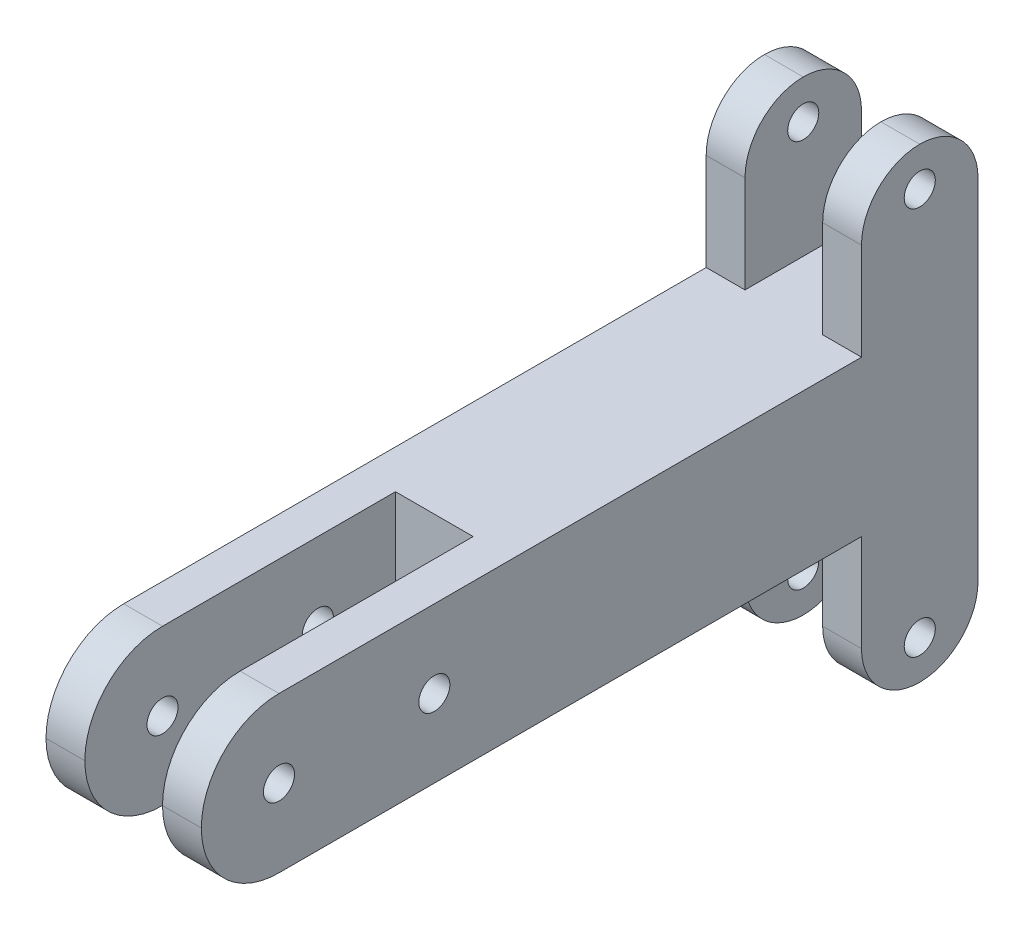
ISO-10303-21;
HEADER;
FILE_DESCRIPTION(('STEP AP214'),'2;1');
FILE_NAME('part.step','',(''),(''),'','','');
FILE_SCHEMA(('AUTOMOTIVE_DESIGN { 1 0 10303 214 1 1 1 1 }'));
ENDSEC;
DATA;
#1=APPLICATION_CONTEXT('core data for automotive mechanical design processes');
#2=APPLICATION_PROTOCOL_DEFINITION('international standard','automotive_design',2000,#1);
#3=PRODUCT_CONTEXT('',#1,'mechanical');
#4=PRODUCT('Part','Part','',(#3));
#5=PRODUCT_RELATED_PRODUCT_CATEGORY('part','',(#4));
#6=PRODUCT_DEFINITION_FORMATION('','',#4);
#7=PRODUCT_DEFINITION_CONTEXT('part definition',#1,'design');
#8=PRODUCT_DEFINITION('design','',#6,#7);
#9=PRODUCT_DEFINITION_SHAPE('','',#8);
#10=(LENGTH_UNIT() NAMED_UNIT(*) SI_UNIT(.MILLI.,.METRE.));
#11=(NAMED_UNIT(*) PLANE_ANGLE_UNIT() SI_UNIT($,.RADIAN.));
#12=(NAMED_UNIT(*) SI_UNIT($,.STERADIAN.) SOLID_ANGLE_UNIT());
#13=UNCERTAINTY_MEASURE_WITH_UNIT(LENGTH_MEASURE(1.E-05),#10,'distance_accuracy_value','');
#14=(GEOMETRIC_REPRESENTATION_CONTEXT(3) GLOBAL_UNCERTAINTY_ASSIGNED_CONTEXT((#13)) GLOBAL_UNIT_ASSIGNED_CONTEXT((#10,
#11,#12)) REPRESENTATION_CONTEXT('',''));
#15=CARTESIAN_POINT('',(0.,0.,0.));
#16=DIRECTION('',(0.,0.,1.));
#17=DIRECTION('',(1.,0.,0.));
#18=AXIS2_PLACEMENT_3D('',#15,#16,#17);
#19=CARTESIAN_POINT('',(-9.99999999999999,40.,-35.));
#20=DIRECTION('',(0.,0.,-1.));
#21=DIRECTION('',(-1.,0.,0.));
#22=AXIS2_PLACEMENT_3D('',#19,#20,#21);
#23=PLANE('',#22);
#24=DIRECTION('',(0.,-1.,0.));
#25=VECTOR('',#24,1.);
#26=CARTESIAN_POINT('',(10.,40.,-35.));
#27=LINE('',#26,#25);
#28=CARTESIAN_POINT('',(10.,32.5,-35.));
#29=VERTEX_POINT('',#28);
#30=CARTESIAN_POINT('',(10.,20.,-35.));
#31=VERTEX_POINT('',#30);
#32=EDGE_CURVE('E238',#29,#31,#27,.T.);
#33=ORIENTED_EDGE('',*,*,#32,.F.);
#34=DIRECTION('',(1.,0.,0.));
#35=VECTOR('',#34,1.);
#36=CARTESIAN_POINT('',(5.,32.5,-35.));
#37=LINE('',#36,#35);
#38=CARTESIAN_POINT('',(5.,32.5,-35.));
#39=VERTEX_POINT('',#38);
#40=EDGE_CURVE('E227',#29,#39,#37,.F.);
#41=ORIENTED_EDGE('',*,*,#40,.T.);
#42=DIRECTION('',(0.,1.,0.));
#43=VECTOR('',#42,1.);
#44=CARTESIAN_POINT('',(5.,40.,-35.));
#45=LINE('',#44,#43);
#46=CARTESIAN_POINT('',(5.,20.,-35.));
#47=VERTEX_POINT('',#46);
#48=EDGE_CURVE('E210',#47,#39,#45,.T.);
#49=ORIENTED_EDGE('',*,*,#48,.F.);
#50=DIRECTION('',(1.,0.,0.));
#51=VECTOR('',#50,1.);
#52=CARTESIAN_POINT('',(-9.99999999999999,20.,-35.));
#53=LINE('',#52,#51);
#54=EDGE_CURVE('E224',#47,#31,#53,.T.);
#55=ORIENTED_EDGE('',*,*,#54,.T.);
#56=EDGE_LOOP('',(#33,#41,#49,#55));
#57=FACE_BOUND('',#56,.T.);
#58=ADVANCED_FACE('F33',(#57),#23,.F.);
#59=CARTESIAN_POINT('',(-9.99999999999999,-20.,-35.));
#60=DIRECTION('',(0.,0.,1.));
#61=DIRECTION('',(1.,0.,0.));
#62=AXIS2_PLACEMENT_3D('',#59,#60,#61);
#63=PLANE('',#62);
#64=DIRECTION('',(0.,-1.,0.));
#65=VECTOR('',#64,1.);
#66=CARTESIAN_POINT('',(4.99999999999999,-20.,-35.));
#67=LINE('',#66,#65);
#68=CARTESIAN_POINT('',(4.99999999999999,0.,-35.));
#69=VERTEX_POINT('',#68);
#70=CARTESIAN_POINT('',(4.99999999999999,-12.5,-35.));
#71=VERTEX_POINT('',#70);
#72=EDGE_CURVE('E418',#69,#71,#67,.T.);
#73=ORIENTED_EDGE('',*,*,#72,.T.);
#74=DIRECTION('',(1.,0.,0.));
#75=VECTOR('',#74,1.);
#76=CARTESIAN_POINT('',(-9.99999999999999,-12.5,-35.));
#77=LINE('',#76,#75);
#78=CARTESIAN_POINT('',(10.,-12.5,-35.));
#79=VERTEX_POINT('',#78);
#80=EDGE_CURVE('E374',#71,#79,#77,.T.);
#81=ORIENTED_EDGE('',*,*,#80,.T.);
#82=DIRECTION('',(0.,1.,0.));
#83=VECTOR('',#82,1.);
#84=CARTESIAN_POINT('',(10.,-20.,-35.));
#85=LINE('',#84,#83);
#86=CARTESIAN_POINT('',(10.,0.,-35.));
#87=VERTEX_POINT('',#86);
#88=EDGE_CURVE('E235',#79,#87,#85,.T.);
#89=ORIENTED_EDGE('',*,*,#88,.T.);
#90=DIRECTION('',(1.,0.,0.));
#91=VECTOR('',#90,1.);
#92=CARTESIAN_POINT('',(-9.99999999999999,0.,-35.));
#93=LINE('',#92,#91);
#94=EDGE_CURVE('E432',#69,#87,#93,.T.);
#95=ORIENTED_EDGE('',*,*,#94,.F.);
#96=EDGE_LOOP('',(#73,#81,#89,#95));
#97=FACE_BOUND('',#96,.T.);
#98=ADVANCED_FACE('F472',(#97),#63,.T.);
#99=CARTESIAN_POINT('',(10.,-15.,-42.5));
#100=DIRECTION('',(-1.,0.,0.));
#101=DIRECTION('',(0.,0.,1.));
#102=AXIS2_PLACEMENT_3D('',#99,#100,#101);
#103=CYLINDRICAL_SURFACE('',#102,2.);
#104=CARTESIAN_POINT('',(4.99999999999999,-15.,-42.5));
#105=DIRECTION('',(1.,0.,0.));
#106=DIRECTION('',(0.,0.,-1.));
#107=AXIS2_PLACEMENT_3D('',#104,#105,#106);
#108=CIRCLE('',#107,2.);
#109=CARTESIAN_POINT('',(4.99999999999999,-15.,-44.5));
#110=VERTEX_POINT('',#109);
#111=EDGE_CURVE('E428',#110,#110,#108,.T.);
#112=ORIENTED_EDGE('',*,*,#111,.F.);
#113=EDGE_LOOP('',(#112));
#114=FACE_BOUND('',#113,.T.);
#115=CARTESIAN_POINT('',(10.,-15.,-42.5));
#116=DIRECTION('',(-1.,0.,0.));
#117=DIRECTION('',(0.,0.,1.));
#118=AXIS2_PLACEMENT_3D('',#115,#116,#117);
#119=CIRCLE('',#118,2.);
#120=CARTESIAN_POINT('',(10.,-15.,-40.5));
#121=VERTEX_POINT('',#120);
#122=EDGE_CURVE('E436',#121,#121,#119,.T.);
#123=ORIENTED_EDGE('',*,*,#122,.F.);
#124=EDGE_LOOP('',(#123));
#125=FACE_BOUND('',#124,.T.);
#126=ADVANCED_FACE('F597',(#114,#125),#103,.F.);
#127=CARTESIAN_POINT('',(10.,35.,-42.5));
#128=DIRECTION('',(-1.,0.,0.));
#129=DIRECTION('',(0.,0.,1.));
#130=AXIS2_PLACEMENT_3D('',#127,#128,#129);
#131=CYLINDRICAL_SURFACE('',#130,2.);
#132=CARTESIAN_POINT('',(5.,35.,-42.5));
#133=DIRECTION('',(1.,0.,0.));
#134=DIRECTION('',(0.,1.,0.));
#135=AXIS2_PLACEMENT_3D('',#132,#133,#134);
#136=CIRCLE('',#135,2.);
#137=CARTESIAN_POINT('',(5.,37.,-42.5));
#138=VERTEX_POINT('',#137);
#139=EDGE_CURVE('E442',#138,#138,#136,.T.);
#140=ORIENTED_EDGE('',*,*,#139,.F.);
#141=EDGE_LOOP('',(#140));
#142=FACE_BOUND('',#141,.T.);
#143=CARTESIAN_POINT('',(10.,35.,-42.5));
#144=DIRECTION('',(-1.,0.,0.));
#145=DIRECTION('',(0.,0.,1.));
#146=AXIS2_PLACEMENT_3D('',#143,#144,#145);
#147=CIRCLE('',#146,2.);
#148=CARTESIAN_POINT('',(10.,35.,-40.5));
#149=VERTEX_POINT('',#148);
#150=EDGE_CURVE('E429',#149,#149,#147,.T.);
#151=ORIENTED_EDGE('',*,*,#150,.F.);
#152=EDGE_LOOP('',(#151));
#153=FACE_BOUND('',#152,.T.);
#154=ADVANCED_FACE('F502',(#142,#153),#131,.F.);
#155=CARTESIAN_POINT('',(0.,20.,0.));
#156=DIRECTION('',(0.,-1.,0.));
#157=DIRECTION('',(0.,0.,-1.));
#158=AXIS2_PLACEMENT_3D('',#155,#156,#157);
#159=PLANE('',#158);
#160=CARTESIAN_POINT('',(-10.,20.,-35.));
#161=VERTEX_POINT('',#160);
#162=CARTESIAN_POINT('',(-5.00000000000001,20.,-35.));
#163=VERTEX_POINT('',#162);
#164=EDGE_CURVE('E234',#161,#163,#53,.T.);
#165=ORIENTED_EDGE('',*,*,#164,.F.);
#166=DIRECTION('',(0.,0.,1.));
#167=VECTOR('',#166,1.);
#168=CARTESIAN_POINT('',(-10.,20.,50.));
#169=LINE('',#168,#167);
#170=CARTESIAN_POINT('',(-10.,20.,40.));
#171=VERTEX_POINT('',#170);
#172=EDGE_CURVE('E291',#161,#171,#169,.T.);
#173=ORIENTED_EDGE('',*,*,#172,.T.);
#174=DIRECTION('',(1.,0.,0.));
#175=VECTOR('',#174,1.);
#176=CARTESIAN_POINT('',(0.,20.,40.));
#177=LINE('',#176,#175);
#178=CARTESIAN_POINT('',(-5.,20.,40.));
#179=VERTEX_POINT('',#178);
#180=EDGE_CURVE('E332',#171,#179,#177,.T.);
#181=ORIENTED_EDGE('',*,*,#180,.T.);
#182=DIRECTION('',(0.,0.,1.));
#183=VECTOR('',#182,1.);
#184=CARTESIAN_POINT('',(-5.,20.,50.));
#185=LINE('',#184,#183);
#186=CARTESIAN_POINT('',(-5.,20.,10.));
#187=VERTEX_POINT('',#186);
#188=EDGE_CURVE('E268',#187,#179,#185,.T.);
#189=ORIENTED_EDGE('',*,*,#188,.F.);
#190=DIRECTION('',(-1.,0.,0.));
#191=VECTOR('',#190,1.);
#192=CARTESIAN_POINT('',(-5.,20.,10.));
#193=LINE('',#192,#191);
#194=CARTESIAN_POINT('',(5.,20.,10.));
#195=VERTEX_POINT('',#194);
#196=EDGE_CURVE('E273',#195,#187,#193,.T.);
#197=ORIENTED_EDGE('',*,*,#196,.F.);
#198=DIRECTION('',(0.,0.,-1.));
#199=VECTOR('',#198,1.);
#200=CARTESIAN_POINT('',(5.,20.,50.));
#201=LINE('',#200,#199);
#202=CARTESIAN_POINT('',(5.,20.,40.));
#203=VERTEX_POINT('',#202);
#204=EDGE_CURVE('E281',#203,#195,#201,.T.);
#205=ORIENTED_EDGE('',*,*,#204,.F.);
#206=DIRECTION('',(1.,0.,0.));
#207=VECTOR('',#206,1.);
#208=CARTESIAN_POINT('',(0.,20.,40.));
#209=LINE('',#208,#207);
#210=CARTESIAN_POINT('',(10.,20.,40.));
#211=VERTEX_POINT('',#210);
#212=EDGE_CURVE('E330',#203,#211,#209,.T.);
#213=ORIENTED_EDGE('',*,*,#212,.T.);
#214=DIRECTION('',(0.,0.,-1.));
#215=VECTOR('',#214,1.);
#216=CARTESIAN_POINT('',(10.,20.,50.));
#217=LINE('',#216,#215);
#218=EDGE_CURVE('E233',#211,#31,#217,.T.);
#219=ORIENTED_EDGE('',*,*,#218,.T.);
#220=ORIENTED_EDGE('',*,*,#54,.F.);
#221=DIRECTION('',(0.,0.,-1.));
#222=VECTOR('',#221,1.);
#223=CARTESIAN_POINT('',(5.,20.,50.001));
#224=LINE('',#223,#222);
#225=CARTESIAN_POINT('',(5.,20.,-50.));
#226=VERTEX_POINT('',#225);
#227=EDGE_CURVE('E206',#47,#226,#224,.T.);
#228=ORIENTED_EDGE('',*,*,#227,.T.);
#229=DIRECTION('',(-1.,0.,0.));
#230=VECTOR('',#229,1.);
#231=CARTESIAN_POINT('',(5.,20.,-50.));
#232=LINE('',#231,#230);
#233=CARTESIAN_POINT('',(-5.00000000000001,20.,-50.));
#234=VERTEX_POINT('',#233);
#235=EDGE_CURVE('E488',#226,#234,#232,.T.);
#236=ORIENTED_EDGE('',*,*,#235,.T.);
#237=DIRECTION('',(0.,0.,-1.));
#238=VECTOR('',#237,1.);
#239=CARTESIAN_POINT('',(-5.00000000000001,20.,50.001));
#240=LINE('',#239,#238);
#241=EDGE_CURVE('E217',#163,#234,#240,.T.);
#242=ORIENTED_EDGE('',*,*,#241,.F.);
#243=EDGE_LOOP('',(#165,#173,#181,#189,#197,#205,#213,#219,#220,#228,#236,#242));
#244=FACE_BOUND('',#243,.T.);
#245=ADVANCED_FACE('F231',(#244),#159,.F.);
#246=CARTESIAN_POINT('',(10.,20.,50.));
#247=DIRECTION('',(-1.,0.,0.));
#248=DIRECTION('',(0.,0.,1.));
#249=AXIS2_PLACEMENT_3D('',#246,#247,#248);
#250=PLANE('',#249);
#251=ORIENTED_EDGE('',*,*,#150,.T.);
#252=EDGE_LOOP('',(#251));
#253=FACE_BOUND('',#252,.T.);
#254=ORIENTED_EDGE('',*,*,#122,.T.);
#255=EDGE_LOOP('',(#254));
#256=FACE_BOUND('',#255,.T.);
#257=CARTESIAN_POINT('',(10.,10.,40.));
#258=DIRECTION('',(1.,0.,0.));
#259=DIRECTION('',(0.,0.,-1.));
#260=AXIS2_PLACEMENT_3D('',#257,#258,#259);
#261=CIRCLE('',#260,2.);
#262=CARTESIAN_POINT('',(10.,10.,38.));
#263=VERTEX_POINT('',#262);
#264=EDGE_CURVE('E251',#263,#263,#261,.T.);
#265=ORIENTED_EDGE('',*,*,#264,.F.);
#266=EDGE_LOOP('',(#265));
#267=FACE_BOUND('',#266,.T.);
#268=CARTESIAN_POINT('',(10.,10.,20.));
#269=DIRECTION('',(1.,0.,0.));
#270=DIRECTION('',(0.,0.,-1.));
#271=AXIS2_PLACEMENT_3D('',#268,#269,#270);
#272=CIRCLE('',#271,2.);
#273=CARTESIAN_POINT('',(10.,10.,18.));
#274=VERTEX_POINT('',#273);
#275=EDGE_CURVE('E257',#274,#274,#272,.T.);
#276=ORIENTED_EDGE('',*,*,#275,.F.);
#277=EDGE_LOOP('',(#276));
#278=FACE_BOUND('',#277,.T.);
#279=CARTESIAN_POINT('',(10.,32.5,-42.5));
#280=DIRECTION('',(-1.,0.,0.));
#281=DIRECTION('',(0.,0.,1.));
#282=AXIS2_PLACEMENT_3D('',#279,#280,#281);
#283=CIRCLE('',#282,7.5);
#284=CARTESIAN_POINT('',(10.,32.5,-50.));
#285=VERTEX_POINT('',#284);
#286=CARTESIAN_POINT('',(10.,40.,-42.5));
#287=VERTEX_POINT('',#286);
#288=EDGE_CURVE('E365',#285,#287,#283,.F.);
#289=ORIENTED_EDGE('',*,*,#288,.T.);
#290=CARTESIAN_POINT('',(10.,32.5,-42.5));
#291=DIRECTION('',(-1.,0.,0.));
#292=DIRECTION('',(0.,0.,1.));
#293=AXIS2_PLACEMENT_3D('',#290,#291,#292);
#294=CIRCLE('',#293,7.5);
#295=EDGE_CURVE('E367',#287,#29,#294,.F.);
#296=ORIENTED_EDGE('',*,*,#295,.T.);
#297=ORIENTED_EDGE('',*,*,#32,.T.);
#298=ORIENTED_EDGE('',*,*,#218,.F.);
#299=CARTESIAN_POINT('',(10.,10.,40.));
#300=DIRECTION('',(-1.,0.,0.));
#301=DIRECTION('',(0.,0.,1.));
#302=AXIS2_PLACEMENT_3D('',#299,#300,#301);
#303=CIRCLE('',#302,10.);
#304=CARTESIAN_POINT('',(10.,10.,50.));
#305=VERTEX_POINT('',#304);
#306=EDGE_CURVE('E303',#211,#305,#303,.F.);
#307=ORIENTED_EDGE('',*,*,#306,.T.);
#308=CARTESIAN_POINT('',(10.,10.,40.));
#309=DIRECTION('',(-1.,0.,0.));
#310=DIRECTION('',(0.,0.,1.));
#311=AXIS2_PLACEMENT_3D('',#308,#309,#310);
#312=CIRCLE('',#311,10.);
#313=CARTESIAN_POINT('',(10.,0.,40.));
#314=VERTEX_POINT('',#313);
#315=EDGE_CURVE('E309',#305,#314,#312,.F.);
#316=ORIENTED_EDGE('',*,*,#315,.T.);
#317=DIRECTION('',(0.,0.,-1.));
#318=VECTOR('',#317,1.);
#319=CARTESIAN_POINT('',(10.,0.,50.));
#320=LINE('',#319,#318);
#321=EDGE_CURVE('E287',#314,#87,#320,.T.);
#322=ORIENTED_EDGE('',*,*,#321,.T.);
#323=ORIENTED_EDGE('',*,*,#88,.F.);
#324=CARTESIAN_POINT('',(10.,-12.5,-42.5));
#325=DIRECTION('',(-1.,0.,0.));
#326=DIRECTION('',(0.,0.,1.));
#327=AXIS2_PLACEMENT_3D('',#324,#325,#326);
#328=CIRCLE('',#327,7.5);
#329=CARTESIAN_POINT('',(10.,-20.,-42.5));
#330=VERTEX_POINT('',#329);
#331=EDGE_CURVE('E363',#79,#330,#328,.F.);
#332=ORIENTED_EDGE('',*,*,#331,.T.);
#333=CARTESIAN_POINT('',(10.,-12.5,-42.5));
#334=DIRECTION('',(-1.,0.,0.));
#335=DIRECTION('',(0.,0.,1.));
#336=AXIS2_PLACEMENT_3D('',#333,#334,#335);
#337=CIRCLE('',#336,7.5);
#338=CARTESIAN_POINT('',(10.,-12.5,-50.));
#339=VERTEX_POINT('',#338);
#340=EDGE_CURVE('E361',#330,#339,#337,.F.);
#341=ORIENTED_EDGE('',*,*,#340,.T.);
#342=DIRECTION('',(0.,-1.,0.));
#343=VECTOR('',#342,1.);
#344=CARTESIAN_POINT('',(10.,20.,-50.));
#345=LINE('',#344,#343);
#346=EDGE_CURVE('E300',#285,#339,#345,.T.);
#347=ORIENTED_EDGE('',*,*,#346,.F.);
#348=EDGE_LOOP('',(#289,#296,#297,#298,#307,#316,#322,#323,#332,#341,#347));
#349=FACE_BOUND('',#348,.T.);
#350=ADVANCED_FACE('F564',(#253,#256,#267,#278,#349),#250,.F.);
#351=CARTESIAN_POINT('',(-10.,20.,-50.));
#352=DIRECTION('',(0.,0.,1.));
#353=DIRECTION('',(1.,0.,0.));
#354=AXIS2_PLACEMENT_3D('',#351,#352,#353);
#355=PLANE('',#354);
#356=DIRECTION('',(0.,-1.,0.));
#357=VECTOR('',#356,1.);
#358=CARTESIAN_POINT('',(-10.,20.,-50.));
#359=LINE('',#358,#357);
#360=CARTESIAN_POINT('',(-10.,32.5,-50.));
#361=VERTEX_POINT('',#360);
#362=CARTESIAN_POINT('',(-10.,-12.5,-50.));
#363=VERTEX_POINT('',#362);
#364=EDGE_CURVE('E294',#361,#363,#359,.T.);
#365=ORIENTED_EDGE('',*,*,#364,.F.);
#366=DIRECTION('',(-1.,0.,0.));
#367=VECTOR('',#366,1.);
#368=CARTESIAN_POINT('',(-5.00000000000001,32.5,-50.));
#369=LINE('',#368,#367);
#370=CARTESIAN_POINT('',(-5.00000000000001,32.5,-50.));
#371=VERTEX_POINT('',#370);
#372=EDGE_CURVE('E359',#361,#371,#369,.F.);
#373=ORIENTED_EDGE('',*,*,#372,.T.);
#374=DIRECTION('',(0.,1.,0.));
#375=VECTOR('',#374,1.);
#376=CARTESIAN_POINT('',(-5.00000000000001,40.,-50.));
#377=LINE('',#376,#375);
#378=EDGE_CURVE('E218',#234,#371,#377,.T.);
#379=ORIENTED_EDGE('',*,*,#378,.F.);
#380=ORIENTED_EDGE('',*,*,#235,.F.);
#381=DIRECTION('',(0.,-1.,0.));
#382=VECTOR('',#381,1.);
#383=CARTESIAN_POINT('',(5.,40.,-50.));
#384=LINE('',#383,#382);
#385=CARTESIAN_POINT('',(5.,32.5,-50.));
#386=VERTEX_POINT('',#385);
#387=EDGE_CURVE('E212',#386,#226,#384,.T.);
#388=ORIENTED_EDGE('',*,*,#387,.F.);
#389=DIRECTION('',(-1.,0.,0.));
#390=VECTOR('',#389,1.);
#391=CARTESIAN_POINT('',(10.,32.5,-50.));
#392=LINE('',#391,#390);
#393=EDGE_CURVE('E357',#386,#285,#392,.F.);
#394=ORIENTED_EDGE('',*,*,#393,.T.);
#395=ORIENTED_EDGE('',*,*,#346,.T.);
#396=DIRECTION('',(-1.,0.,0.));
#397=VECTOR('',#396,1.);
#398=CARTESIAN_POINT('',(4.99999999999999,-12.5,-50.));
#399=LINE('',#398,#397);
#400=CARTESIAN_POINT('',(4.99999999999999,-12.5,-50.));
#401=VERTEX_POINT('',#400);
#402=EDGE_CURVE('E355',#339,#401,#399,.T.);
#403=ORIENTED_EDGE('',*,*,#402,.T.);
#404=DIRECTION('',(0.,-1.,0.));
#405=VECTOR('',#404,1.);
#406=CARTESIAN_POINT('',(4.99999999999999,-20.,-50.));
#407=LINE('',#406,#405);
#408=CARTESIAN_POINT('',(4.99999999999999,0.,-50.));
#409=VERTEX_POINT('',#408);
#410=EDGE_CURVE('E413',#409,#401,#407,.T.);
#411=ORIENTED_EDGE('',*,*,#410,.F.);
#412=DIRECTION('',(1.,0.,0.));
#413=VECTOR('',#412,1.);
#414=CARTESIAN_POINT('',(4.99999999999999,0.,-50.));
#415=LINE('',#414,#413);
#416=CARTESIAN_POINT('',(-5.00000000000001,0.,-50.));
#417=VERTEX_POINT('',#416);
#418=EDGE_CURVE('E412',#417,#409,#415,.T.);
#419=ORIENTED_EDGE('',*,*,#418,.F.);
#420=DIRECTION('',(0.,1.,0.));
#421=VECTOR('',#420,1.);
#422=CARTESIAN_POINT('',(-5.00000000000001,-20.,-50.));
#423=LINE('',#422,#421);
#424=CARTESIAN_POINT('',(-5.00000000000001,-12.5,-50.));
#425=VERTEX_POINT('',#424);
#426=EDGE_CURVE('E404',#425,#417,#423,.T.);
#427=ORIENTED_EDGE('',*,*,#426,.F.);
#428=DIRECTION('',(-1.,0.,0.));
#429=VECTOR('',#428,1.);
#430=CARTESIAN_POINT('',(-10.,-12.5,-50.));
#431=LINE('',#430,#429);
#432=EDGE_CURVE('E353',#425,#363,#431,.T.);
#433=ORIENTED_EDGE('',*,*,#432,.T.);
#434=EDGE_LOOP('',(#365,#373,#379,#380,#388,#394,#395,#403,#411,#419,#427,#433));
#435=FACE_BOUND('',#434,.T.);
#436=ADVANCED_FACE('F409',(#435),#355,.F.);
#437=CARTESIAN_POINT('',(-10.,20.,50.));
#438=DIRECTION('',(1.,0.,0.));
#439=DIRECTION('',(0.,0.,-1.));
#440=AXIS2_PLACEMENT_3D('',#437,#438,#439);
#441=PLANE('',#440);
#442=CARTESIAN_POINT('',(-10.,35.,-42.5));
#443=DIRECTION('',(-1.,0.,0.));
#444=DIRECTION('',(0.,0.,1.));
#445=AXIS2_PLACEMENT_3D('',#442,#443,#444);
#446=CIRCLE('',#445,2.);
#447=CARTESIAN_POINT('',(-10.,35.,-40.5));
#448=VERTEX_POINT('',#447);
#449=EDGE_CURVE('E433',#448,#448,#446,.T.);
#450=ORIENTED_EDGE('',*,*,#449,.F.);
#451=EDGE_LOOP('',(#450));
#452=FACE_BOUND('',#451,.T.);
#453=CARTESIAN_POINT('',(-10.,-15.,-42.5));
#454=DIRECTION('',(-1.,0.,0.));
#455=DIRECTION('',(0.,0.,1.));
#456=AXIS2_PLACEMENT_3D('',#453,#454,#455);
#457=CIRCLE('',#456,2.);
#458=CARTESIAN_POINT('',(-10.,-15.,-40.5));
#459=VERTEX_POINT('',#458);
#460=EDGE_CURVE('E439',#459,#459,#457,.T.);
#461=ORIENTED_EDGE('',*,*,#460,.F.);
#462=EDGE_LOOP('',(#461));
#463=FACE_BOUND('',#462,.T.);
#464=CARTESIAN_POINT('',(-10.,10.,40.));
#465=DIRECTION('',(1.,0.,0.));
#466=DIRECTION('',(0.,0.,-1.));
#467=AXIS2_PLACEMENT_3D('',#464,#465,#466);
#468=CIRCLE('',#467,2.);
#469=CARTESIAN_POINT('',(-10.,10.,38.));
#470=VERTEX_POINT('',#469);
#471=EDGE_CURVE('E247',#470,#470,#468,.T.);
#472=ORIENTED_EDGE('',*,*,#471,.T.);
#473=EDGE_LOOP('',(#472));
#474=FACE_BOUND('',#473,.T.);
#475=CARTESIAN_POINT('',(-10.,10.,20.));
#476=DIRECTION('',(1.,0.,0.));
#477=DIRECTION('',(0.,0.,-1.));
#478=AXIS2_PLACEMENT_3D('',#475,#476,#477);
#479=CIRCLE('',#478,2.);
#480=CARTESIAN_POINT('',(-10.,10.,18.));
#481=VERTEX_POINT('',#480);
#482=EDGE_CURVE('E254',#481,#481,#479,.T.);
#483=ORIENTED_EDGE('',*,*,#482,.T.);
#484=EDGE_LOOP('',(#483));
#485=FACE_BOUND('',#484,.T.);
#486=DIRECTION('',(0.,-1.,0.));
#487=VECTOR('',#486,1.);
#488=CARTESIAN_POINT('',(-9.99999999999999,40.,-35.));
#489=LINE('',#488,#487);
#490=CARTESIAN_POINT('',(-9.99999999999999,32.5,-35.));
#491=VERTEX_POINT('',#490);
#492=EDGE_CURVE('E244',#491,#161,#489,.T.);
#493=ORIENTED_EDGE('',*,*,#492,.F.);
#494=CARTESIAN_POINT('',(-10.,32.5,-42.5));
#495=DIRECTION('',(1.,0.,0.));
#496=DIRECTION('',(0.,0.,-1.));
#497=AXIS2_PLACEMENT_3D('',#494,#495,#496);
#498=CIRCLE('',#497,7.5);
#499=CARTESIAN_POINT('',(-10.,40.,-42.5));
#500=VERTEX_POINT('',#499);
#501=EDGE_CURVE('E351',#491,#500,#498,.F.);
#502=ORIENTED_EDGE('',*,*,#501,.T.);
#503=CARTESIAN_POINT('',(-10.,32.5,-42.5));
#504=DIRECTION('',(1.,0.,0.));
#505=DIRECTION('',(0.,0.,-1.));
#506=AXIS2_PLACEMENT_3D('',#503,#504,#505);
#507=CIRCLE('',#506,7.5);
#508=EDGE_CURVE('E349',#500,#361,#507,.F.);
#509=ORIENTED_EDGE('',*,*,#508,.T.);
#510=ORIENTED_EDGE('',*,*,#364,.T.);
#511=CARTESIAN_POINT('',(-10.,-12.5,-42.5));
#512=DIRECTION('',(1.,0.,0.));
#513=DIRECTION('',(0.,0.,-1.));
#514=AXIS2_PLACEMENT_3D('',#511,#512,#513);
#515=CIRCLE('',#514,7.5);
#516=CARTESIAN_POINT('',(-10.,-20.,-42.5));
#517=VERTEX_POINT('',#516);
#518=EDGE_CURVE('E345',#363,#517,#515,.F.);
#519=ORIENTED_EDGE('',*,*,#518,.T.);
#520=CARTESIAN_POINT('',(-10.,-12.5,-42.5));
#521=DIRECTION('',(1.,0.,0.));
#522=DIRECTION('',(0.,0.,-1.));
#523=AXIS2_PLACEMENT_3D('',#520,#521,#522);
#524=CIRCLE('',#523,7.5);
#525=CARTESIAN_POINT('',(-9.99999999999999,-12.5,-35.));
#526=VERTEX_POINT('',#525);
#527=EDGE_CURVE('E347',#517,#526,#524,.F.);
#528=ORIENTED_EDGE('',*,*,#527,.T.);
#529=DIRECTION('',(0.,1.,0.));
#530=VECTOR('',#529,1.);
#531=CARTESIAN_POINT('',(-9.99999999999999,-20.,-35.));
#532=LINE('',#531,#530);
#533=CARTESIAN_POINT('',(-9.99999999999999,0.,-35.));
#534=VERTEX_POINT('',#533);
#535=EDGE_CURVE('E239',#526,#534,#532,.T.);
#536=ORIENTED_EDGE('',*,*,#535,.T.);
#537=DIRECTION('',(0.,0.,1.));
#538=VECTOR('',#537,1.);
#539=CARTESIAN_POINT('',(-10.,0.,50.));
#540=LINE('',#539,#538);
#541=CARTESIAN_POINT('',(-10.,0.,40.));
#542=VERTEX_POINT('',#541);
#543=EDGE_CURVE('E292',#534,#542,#540,.T.);
#544=ORIENTED_EDGE('',*,*,#543,.T.);
#545=CARTESIAN_POINT('',(-10.,10.,40.));
#546=DIRECTION('',(1.,0.,0.));
#547=DIRECTION('',(0.,0.,-1.));
#548=AXIS2_PLACEMENT_3D('',#545,#546,#547);
#549=CIRCLE('',#548,10.);
#550=CARTESIAN_POINT('',(-10.,10.,50.));
#551=VERTEX_POINT('',#550);
#552=EDGE_CURVE('E328',#542,#551,#549,.F.);
#553=ORIENTED_EDGE('',*,*,#552,.T.);
#554=CARTESIAN_POINT('',(-10.,10.,40.));
#555=DIRECTION('',(1.,0.,0.));
#556=DIRECTION('',(0.,0.,-1.));
#557=AXIS2_PLACEMENT_3D('',#554,#555,#556);
#558=CIRCLE('',#557,10.);
#559=EDGE_CURVE('E325',#551,#171,#558,.F.);
#560=ORIENTED_EDGE('',*,*,#559,.T.);
#561=ORIENTED_EDGE('',*,*,#172,.F.);
#562=EDGE_LOOP('',(#493,#502,#509,#510,#519,#528,#536,#544,#553,#560,#561));
#563=FACE_BOUND('',#562,.T.);
#564=ADVANCED_FACE('F449',(#452,#463,#474,#485,#563),#441,.F.);
#565=CARTESIAN_POINT('',(0.,0.,0.));
#566=DIRECTION('',(0.,-1.,0.));
#567=DIRECTION('',(0.,0.,-1.));
#568=AXIS2_PLACEMENT_3D('',#565,#566,#567);
#569=PLANE('',#568);
#570=CARTESIAN_POINT('',(-5.00000000000001,0.,-35.));
#571=VERTEX_POINT('',#570);
#572=EDGE_CURVE('E443',#534,#571,#93,.T.);
#573=ORIENTED_EDGE('',*,*,#572,.T.);
#574=DIRECTION('',(0.,0.,-1.));
#575=VECTOR('',#574,1.);
#576=CARTESIAN_POINT('',(-5.00000000000001,0.,50.001));
#577=LINE('',#576,#575);
#578=EDGE_CURVE('E415',#571,#417,#577,.T.);
#579=ORIENTED_EDGE('',*,*,#578,.T.);
#580=ORIENTED_EDGE('',*,*,#418,.T.);
#581=DIRECTION('',(0.,0.,-1.));
#582=VECTOR('',#581,1.);
#583=CARTESIAN_POINT('',(4.99999999999999,0.,50.001));
#584=LINE('',#583,#582);
#585=EDGE_CURVE('E422',#69,#409,#584,.T.);
#586=ORIENTED_EDGE('',*,*,#585,.F.);
#587=ORIENTED_EDGE('',*,*,#94,.T.);
#588=ORIENTED_EDGE('',*,*,#321,.F.);
#589=DIRECTION('',(1.,0.,0.));
#590=VECTOR('',#589,1.);
#591=CARTESIAN_POINT('',(5.,0.,40.));
#592=LINE('',#591,#590);
#593=CARTESIAN_POINT('',(5.,0.,40.));
#594=VERTEX_POINT('',#593);
#595=EDGE_CURVE('E314',#314,#594,#592,.F.);
#596=ORIENTED_EDGE('',*,*,#595,.T.);
#597=DIRECTION('',(0.,0.,-1.));
#598=VECTOR('',#597,1.);
#599=CARTESIAN_POINT('',(5.,0.,50.));
#600=LINE('',#599,#598);
#601=CARTESIAN_POINT('',(5.,0.,10.));
#602=VERTEX_POINT('',#601);
#603=EDGE_CURVE('E272',#594,#602,#600,.T.);
#604=ORIENTED_EDGE('',*,*,#603,.T.);
#605=DIRECTION('',(-1.,0.,0.));
#606=VECTOR('',#605,1.);
#607=CARTESIAN_POINT('',(-5.,0.,10.));
#608=LINE('',#607,#606);
#609=CARTESIAN_POINT('',(-5.,0.,10.));
#610=VERTEX_POINT('',#609);
#611=EDGE_CURVE('E275',#602,#610,#608,.T.);
#612=ORIENTED_EDGE('',*,*,#611,.T.);
#613=DIRECTION('',(0.,0.,1.));
#614=VECTOR('',#613,1.);
#615=CARTESIAN_POINT('',(-5.,0.,50.));
#616=LINE('',#615,#614);
#617=CARTESIAN_POINT('',(-5.,0.,40.));
#618=VERTEX_POINT('',#617);
#619=EDGE_CURVE('E269',#610,#618,#616,.T.);
#620=ORIENTED_EDGE('',*,*,#619,.T.);
#621=DIRECTION('',(1.,0.,0.));
#622=VECTOR('',#621,1.);
#623=CARTESIAN_POINT('',(-10.,0.,40.));
#624=LINE('',#623,#622);
#625=EDGE_CURVE('E311',#618,#542,#624,.F.);
#626=ORIENTED_EDGE('',*,*,#625,.T.);
#627=ORIENTED_EDGE('',*,*,#543,.F.);
#628=EDGE_LOOP('',(#573,#579,#580,#586,#587,#588,#596,#604,#612,#620,#626,#627));
#629=FACE_BOUND('',#628,.T.);
#630=ADVANCED_FACE('F454',(#629),#569,.T.);
#631=CARTESIAN_POINT('',(-5.,0.,50.));
#632=DIRECTION('',(-1.,0.,0.));
#633=DIRECTION('',(0.,0.,1.));
#634=AXIS2_PLACEMENT_3D('',#631,#632,#633);
#635=PLANE('',#634);
#636=CARTESIAN_POINT('',(-5.,10.,40.));
#637=DIRECTION('',(-1.,0.,0.));
#638=DIRECTION('',(0.,0.,1.));
#639=AXIS2_PLACEMENT_3D('',#636,#637,#638);
#640=CIRCLE('',#639,2.);
#641=CARTESIAN_POINT('',(-5.,10.,42.));
#642=VERTEX_POINT('',#641);
#643=EDGE_CURVE('E265',#642,#642,#640,.T.);
#644=ORIENTED_EDGE('',*,*,#643,.T.);
#645=EDGE_LOOP('',(#644));
#646=FACE_BOUND('',#645,.T.);
#647=CARTESIAN_POINT('',(-5.,10.,20.));
#648=DIRECTION('',(-1.,0.,0.));
#649=DIRECTION('',(0.,0.,1.));
#650=AXIS2_PLACEMENT_3D('',#647,#648,#649);
#651=CIRCLE('',#650,2.);
#652=CARTESIAN_POINT('',(-5.,10.,22.));
#653=VERTEX_POINT('',#652);
#654=EDGE_CURVE('E261',#653,#653,#651,.T.);
#655=ORIENTED_EDGE('',*,*,#654,.T.);
#656=EDGE_LOOP('',(#655));
#657=FACE_BOUND('',#656,.T.);
#658=CARTESIAN_POINT('',(-5.,10.,40.));
#659=DIRECTION('',(-1.,0.,0.));
#660=DIRECTION('',(0.,0.,1.));
#661=AXIS2_PLACEMENT_3D('',#658,#659,#660);
#662=CIRCLE('',#661,10.);
#663=CARTESIAN_POINT('',(-5.,10.,50.));
#664=VERTEX_POINT('',#663);
#665=EDGE_CURVE('E321',#179,#664,#662,.F.);
#666=ORIENTED_EDGE('',*,*,#665,.T.);
#667=CARTESIAN_POINT('',(-5.,10.,40.));
#668=DIRECTION('',(-1.,0.,0.));
#669=DIRECTION('',(0.,0.,1.));
#670=AXIS2_PLACEMENT_3D('',#667,#668,#669);
#671=CIRCLE('',#670,10.);
#672=EDGE_CURVE('E323',#664,#618,#671,.F.);
#673=ORIENTED_EDGE('',*,*,#672,.T.);
#674=ORIENTED_EDGE('',*,*,#619,.F.);
#675=DIRECTION('',(0.,1.,0.));
#676=VECTOR('',#675,1.);
#677=CARTESIAN_POINT('',(-5.,0.,10.));
#678=LINE('',#677,#676);
#679=EDGE_CURVE('E285',#610,#187,#678,.T.);
#680=ORIENTED_EDGE('',*,*,#679,.T.);
#681=ORIENTED_EDGE('',*,*,#188,.T.);
#682=EDGE_LOOP('',(#666,#673,#674,#680,#681));
#683=FACE_BOUND('',#682,.T.);
#684=ADVANCED_FACE('F523',(#646,#657,#683),#635,.F.);
#685=CARTESIAN_POINT('',(-5.,0.,10.));
#686=DIRECTION('',(0.,0.,-1.));
#687=DIRECTION('',(-1.,0.,0.));
#688=AXIS2_PLACEMENT_3D('',#685,#686,#687);
#689=PLANE('',#688);
#690=ORIENTED_EDGE('',*,*,#196,.T.);
#691=ORIENTED_EDGE('',*,*,#679,.F.);
#692=ORIENTED_EDGE('',*,*,#611,.F.);
#693=DIRECTION('',(0.,1.,0.));
#694=VECTOR('',#693,1.);
#695=CARTESIAN_POINT('',(5.,0.,10.));
#696=LINE('',#695,#694);
#697=EDGE_CURVE('E278',#602,#195,#696,.T.);
#698=ORIENTED_EDGE('',*,*,#697,.T.);
#699=EDGE_LOOP('',(#690,#691,#692,#698));
#700=FACE_BOUND('',#699,.T.);
#701=ADVANCED_FACE('F526',(#700),#689,.F.);
#702=CARTESIAN_POINT('',(5.,0.,50.));
#703=DIRECTION('',(1.,0.,0.));
#704=DIRECTION('',(0.,0.,-1.));
#705=AXIS2_PLACEMENT_3D('',#702,#703,#704);
#706=PLANE('',#705);
#707=CARTESIAN_POINT('',(5.,10.,40.));
#708=DIRECTION('',(1.,0.,0.));
#709=DIRECTION('',(0.,0.,-1.));
#710=AXIS2_PLACEMENT_3D('',#707,#708,#709);
#711=CIRCLE('',#710,2.);
#712=CARTESIAN_POINT('',(5.,10.,38.));
#713=VERTEX_POINT('',#712);
#714=EDGE_CURVE('E264',#713,#713,#711,.T.);
#715=ORIENTED_EDGE('',*,*,#714,.T.);
#716=EDGE_LOOP('',(#715));
#717=FACE_BOUND('',#716,.T.);
#718=CARTESIAN_POINT('',(5.,10.,20.));
#719=DIRECTION('',(1.,0.,0.));
#720=DIRECTION('',(0.,0.,-1.));
#721=AXIS2_PLACEMENT_3D('',#718,#719,#720);
#722=CIRCLE('',#721,2.);
#723=CARTESIAN_POINT('',(5.,10.,18.));
#724=VERTEX_POINT('',#723);
#725=EDGE_CURVE('E250',#724,#724,#722,.T.);
#726=ORIENTED_EDGE('',*,*,#725,.T.);
#727=EDGE_LOOP('',(#726));
#728=FACE_BOUND('',#727,.T.);
#729=ORIENTED_EDGE('',*,*,#603,.F.);
#730=CARTESIAN_POINT('',(5.,10.,40.));
#731=DIRECTION('',(1.,0.,0.));
#732=DIRECTION('',(0.,0.,-1.));
#733=AXIS2_PLACEMENT_3D('',#730,#731,#732);
#734=CIRCLE('',#733,10.);
#735=CARTESIAN_POINT('',(5.,10.,50.));
#736=VERTEX_POINT('',#735);
#737=EDGE_CURVE('E319',#594,#736,#734,.F.);
#738=ORIENTED_EDGE('',*,*,#737,.T.);
#739=CARTESIAN_POINT('',(5.,10.,40.));
#740=DIRECTION('',(1.,0.,0.));
#741=DIRECTION('',(0.,0.,-1.));
#742=AXIS2_PLACEMENT_3D('',#739,#740,#741);
#743=CIRCLE('',#742,10.);
#744=EDGE_CURVE('E317',#736,#203,#743,.F.);
#745=ORIENTED_EDGE('',*,*,#744,.T.);
#746=ORIENTED_EDGE('',*,*,#204,.T.);
#747=ORIENTED_EDGE('',*,*,#697,.F.);
#748=EDGE_LOOP('',(#729,#738,#745,#746,#747));
#749=FACE_BOUND('',#748,.T.);
#750=ADVANCED_FACE('F574',(#717,#728,#749),#706,.F.);
#751=CARTESIAN_POINT('',(-10.,10.,20.));
#752=DIRECTION('',(1.,0.,0.));
#753=DIRECTION('',(0.,0.,-1.));
#754=AXIS2_PLACEMENT_3D('',#751,#752,#753);
#755=CYLINDRICAL_SURFACE('',#754,2.);
#756=ORIENTED_EDGE('',*,*,#275,.T.);
#757=EDGE_LOOP('',(#756));
#758=FACE_BOUND('',#757,.T.);
#759=ORIENTED_EDGE('',*,*,#725,.F.);
#760=EDGE_LOOP('',(#759));
#761=FACE_BOUND('',#760,.T.);
#762=ADVANCED_FACE('F520',(#758,#761),#755,.F.);
#763=CARTESIAN_POINT('',(-10.,10.,40.));
#764=DIRECTION('',(1.,0.,0.));
#765=DIRECTION('',(0.,0.,-1.));
#766=AXIS2_PLACEMENT_3D('',#763,#764,#765);
#767=CYLINDRICAL_SURFACE('',#766,2.);
#768=ORIENTED_EDGE('',*,*,#264,.T.);
#769=EDGE_LOOP('',(#768));
#770=FACE_BOUND('',#769,.T.);
#771=ORIENTED_EDGE('',*,*,#714,.F.);
#772=EDGE_LOOP('',(#771));
#773=FACE_BOUND('',#772,.T.);
#774=ADVANCED_FACE('F518',(#770,#773),#767,.F.);
#775=ORIENTED_EDGE('',*,*,#482,.F.);
#776=EDGE_LOOP('',(#775));
#777=FACE_BOUND('',#776,.T.);
#778=ORIENTED_EDGE('',*,*,#654,.F.);
#779=EDGE_LOOP('',(#778));
#780=FACE_BOUND('',#779,.T.);
#781=ADVANCED_FACE('F514',(#777,#780),#755,.F.);
#782=ORIENTED_EDGE('',*,*,#471,.F.);
#783=EDGE_LOOP('',(#782));
#784=FACE_BOUND('',#783,.T.);
#785=ORIENTED_EDGE('',*,*,#643,.F.);
#786=EDGE_LOOP('',(#785));
#787=FACE_BOUND('',#786,.T.);
#788=ADVANCED_FACE('F517',(#784,#787),#767,.F.);
#789=CARTESIAN_POINT('',(0.,10.,40.));
#790=DIRECTION('',(1.,0.,0.));
#791=DIRECTION('',(0.,0.,-1.));
#792=AXIS2_PLACEMENT_3D('',#789,#790,#791);
#793=CYLINDRICAL_SURFACE('',#792,10.);
#794=ORIENTED_EDGE('',*,*,#212,.F.);
#795=ORIENTED_EDGE('',*,*,#744,.F.);
#796=DIRECTION('',(1.,0.,0.));
#797=VECTOR('',#796,1.);
#798=CARTESIAN_POINT('',(-10.,10.,50.));
#799=LINE('',#798,#797);
#800=EDGE_CURVE('E260',#305,#736,#799,.F.);
#801=ORIENTED_EDGE('',*,*,#800,.F.);
#802=ORIENTED_EDGE('',*,*,#306,.F.);
#803=EDGE_LOOP('',(#794,#795,#801,#802));
#804=FACE_BOUND('',#803,.T.);
#805=ADVANCED_FACE('F579',(#804),#793,.T.);
#806=CARTESIAN_POINT('',(-10.,10.,40.));
#807=DIRECTION('',(-1.,0.,0.));
#808=DIRECTION('',(0.,0.,1.));
#809=AXIS2_PLACEMENT_3D('',#806,#807,#808);
#810=CYLINDRICAL_SURFACE('',#809,10.);
#811=ORIENTED_EDGE('',*,*,#737,.F.);
#812=ORIENTED_EDGE('',*,*,#595,.F.);
#813=ORIENTED_EDGE('',*,*,#315,.F.);
#814=ORIENTED_EDGE('',*,*,#800,.T.);
#815=EDGE_LOOP('',(#811,#812,#813,#814));
#816=FACE_BOUND('',#815,.T.);
#817=ADVANCED_FACE('F570',(#816),#810,.T.);
#818=CARTESIAN_POINT('',(0.,10.,40.));
#819=DIRECTION('',(1.,0.,0.));
#820=DIRECTION('',(0.,0.,-1.));
#821=AXIS2_PLACEMENT_3D('',#818,#819,#820);
#822=CYLINDRICAL_SURFACE('',#821,10.);
#823=ORIENTED_EDGE('',*,*,#180,.F.);
#824=ORIENTED_EDGE('',*,*,#559,.F.);
#825=DIRECTION('',(1.,0.,0.));
#826=VECTOR('',#825,1.);
#827=CARTESIAN_POINT('',(-10.,10.,50.));
#828=LINE('',#827,#826);
#829=EDGE_CURVE('E246',#664,#551,#828,.F.);
#830=ORIENTED_EDGE('',*,*,#829,.F.);
#831=ORIENTED_EDGE('',*,*,#665,.F.);
#832=EDGE_LOOP('',(#823,#824,#830,#831));
#833=FACE_BOUND('',#832,.T.);
#834=ADVANCED_FACE('F537',(#833),#822,.T.);
#835=CARTESIAN_POINT('',(-10.,10.,40.));
#836=DIRECTION('',(-1.,0.,0.));
#837=DIRECTION('',(0.,0.,1.));
#838=AXIS2_PLACEMENT_3D('',#835,#836,#837);
#839=CYLINDRICAL_SURFACE('',#838,10.);
#840=ORIENTED_EDGE('',*,*,#552,.F.);
#841=ORIENTED_EDGE('',*,*,#625,.F.);
#842=ORIENTED_EDGE('',*,*,#672,.F.);
#843=ORIENTED_EDGE('',*,*,#829,.T.);
#844=EDGE_LOOP('',(#840,#841,#842,#843));
#845=FACE_BOUND('',#844,.T.);
#846=ADVANCED_FACE('F539',(#845),#839,.T.);
#847=DIRECTION('',(0.,-1.,0.));
#848=VECTOR('',#847,1.);
#849=CARTESIAN_POINT('',(-5.00000000000001,40.,-35.));
#850=LINE('',#849,#848);
#851=CARTESIAN_POINT('',(-5.00000000000001,32.5,-35.));
#852=VERTEX_POINT('',#851);
#853=EDGE_CURVE('E228',#852,#163,#850,.T.);
#854=ORIENTED_EDGE('',*,*,#853,.F.);
#855=DIRECTION('',(1.,0.,0.));
#856=VECTOR('',#855,1.);
#857=CARTESIAN_POINT('',(-9.99999999999999,32.5,-35.));
#858=LINE('',#857,#856);
#859=EDGE_CURVE('E342',#852,#491,#858,.F.);
#860=ORIENTED_EDGE('',*,*,#859,.T.);
#861=ORIENTED_EDGE('',*,*,#492,.T.);
#862=ORIENTED_EDGE('',*,*,#164,.T.);
#863=EDGE_LOOP('',(#854,#860,#861,#862));
#864=FACE_BOUND('',#863,.T.);
#865=ADVANCED_FACE('F543',(#864),#23,.F.);
#866=ORIENTED_EDGE('',*,*,#535,.F.);
#867=DIRECTION('',(1.,0.,0.));
#868=VECTOR('',#867,1.);
#869=CARTESIAN_POINT('',(-9.99999999999999,-12.5,-35.));
#870=LINE('',#869,#868);
#871=CARTESIAN_POINT('',(-5.00000000000001,-12.5,-35.));
#872=VERTEX_POINT('',#871);
#873=EDGE_CURVE('E381',#526,#872,#870,.T.);
#874=ORIENTED_EDGE('',*,*,#873,.T.);
#875=DIRECTION('',(0.,1.,0.));
#876=VECTOR('',#875,1.);
#877=CARTESIAN_POINT('',(-5.00000000000001,-20.,-35.));
#878=LINE('',#877,#876);
#879=EDGE_CURVE('E387',#872,#571,#878,.T.);
#880=ORIENTED_EDGE('',*,*,#879,.T.);
#881=ORIENTED_EDGE('',*,*,#572,.F.);
#882=EDGE_LOOP('',(#866,#874,#880,#881));
#883=FACE_BOUND('',#882,.T.);
#884=ADVANCED_FACE('F456',(#883),#63,.T.);
#885=CARTESIAN_POINT('',(-5.00000000000001,-15.,-42.5));
#886=DIRECTION('',(-1.,0.,0.));
#887=DIRECTION('',(0.,-1.,0.));
#888=AXIS2_PLACEMENT_3D('',#885,#886,#887);
#889=CIRCLE('',#888,2.);
#890=CARTESIAN_POINT('',(-5.00000000000001,-17.,-42.5));
#891=VERTEX_POINT('',#890);
#892=EDGE_CURVE('E424',#891,#891,#889,.T.);
#893=ORIENTED_EDGE('',*,*,#892,.F.);
#894=EDGE_LOOP('',(#893));
#895=FACE_BOUND('',#894,.T.);
#896=ORIENTED_EDGE('',*,*,#460,.T.);
#897=EDGE_LOOP('',(#896));
#898=FACE_BOUND('',#897,.T.);
#899=ADVANCED_FACE('F500',(#895,#898),#103,.F.);
#900=CARTESIAN_POINT('',(-5.00000000000001,35.,-42.5));
#901=DIRECTION('',(-1.,0.,0.));
#902=DIRECTION('',(0.,-1.,0.));
#903=AXIS2_PLACEMENT_3D('',#900,#901,#902);
#904=CIRCLE('',#903,2.);
#905=CARTESIAN_POINT('',(-5.00000000000001,33.,-42.5));
#906=VERTEX_POINT('',#905);
#907=EDGE_CURVE('E486',#906,#906,#904,.T.);
#908=ORIENTED_EDGE('',*,*,#907,.F.);
#909=EDGE_LOOP('',(#908));
#910=FACE_BOUND('',#909,.T.);
#911=ORIENTED_EDGE('',*,*,#449,.T.);
#912=EDGE_LOOP('',(#911));
#913=FACE_BOUND('',#912,.T.);
#914=ADVANCED_FACE('F497',(#910,#913),#131,.F.);
#915=CARTESIAN_POINT('',(5.,40.,50.001));
#916=DIRECTION('',(1.,0.,0.));
#917=DIRECTION('',(0.,1.,0.));
#918=AXIS2_PLACEMENT_3D('',#915,#916,#917);
#919=PLANE('',#918);
#920=ORIENTED_EDGE('',*,*,#48,.T.);
#921=CARTESIAN_POINT('',(5.,32.5,-42.5));
#922=DIRECTION('',(1.,0.,0.));
#923=DIRECTION('',(0.,1.,0.));
#924=AXIS2_PLACEMENT_3D('',#921,#922,#923);
#925=CIRCLE('',#924,7.5);
#926=CARTESIAN_POINT('',(5.,40.,-42.5));
#927=VERTEX_POINT('',#926);
#928=EDGE_CURVE('E372',#39,#927,#925,.F.);
#929=ORIENTED_EDGE('',*,*,#928,.T.);
#930=CARTESIAN_POINT('',(5.,32.5,-42.5));
#931=DIRECTION('',(1.,0.,0.));
#932=DIRECTION('',(0.,1.,0.));
#933=AXIS2_PLACEMENT_3D('',#930,#931,#932);
#934=CIRCLE('',#933,7.5);
#935=EDGE_CURVE('E370',#927,#386,#934,.F.);
#936=ORIENTED_EDGE('',*,*,#935,.T.);
#937=ORIENTED_EDGE('',*,*,#387,.T.);
#938=ORIENTED_EDGE('',*,*,#227,.F.);
#939=EDGE_LOOP('',(#920,#929,#936,#937,#938));
#940=FACE_BOUND('',#939,.T.);
#941=ORIENTED_EDGE('',*,*,#139,.T.);
#942=EDGE_LOOP('',(#941));
#943=FACE_BOUND('',#942,.T.);
#944=ADVANCED_FACE('F208',(#940,#943),#919,.F.);
#945=CARTESIAN_POINT('',(-5.00000000000001,40.,50.001));
#946=DIRECTION('',(-1.,0.,0.));
#947=DIRECTION('',(0.,-1.,0.));
#948=AXIS2_PLACEMENT_3D('',#945,#946,#947);
#949=PLANE('',#948);
#950=CARTESIAN_POINT('',(-5.00000000000001,32.5,-42.5));
#951=DIRECTION('',(-1.,0.,0.));
#952=DIRECTION('',(0.,-1.,0.));
#953=AXIS2_PLACEMENT_3D('',#950,#951,#952);
#954=CIRCLE('',#953,7.5);
#955=CARTESIAN_POINT('',(-5.00000000000001,40.,-42.5));
#956=VERTEX_POINT('',#955);
#957=EDGE_CURVE('E334',#371,#956,#954,.F.);
#958=ORIENTED_EDGE('',*,*,#957,.T.);
#959=CARTESIAN_POINT('',(-5.00000000000001,32.5,-42.5));
#960=DIRECTION('',(-1.,0.,0.));
#961=DIRECTION('',(0.,-1.,0.));
#962=AXIS2_PLACEMENT_3D('',#959,#960,#961);
#963=CIRCLE('',#962,7.5);
#964=EDGE_CURVE('E340',#956,#852,#963,.F.);
#965=ORIENTED_EDGE('',*,*,#964,.T.);
#966=ORIENTED_EDGE('',*,*,#853,.T.);
#967=ORIENTED_EDGE('',*,*,#241,.T.);
#968=ORIENTED_EDGE('',*,*,#378,.T.);
#969=EDGE_LOOP('',(#958,#965,#966,#967,#968));
#970=FACE_BOUND('',#969,.T.);
#971=ORIENTED_EDGE('',*,*,#907,.T.);
#972=EDGE_LOOP('',(#971));
#973=FACE_BOUND('',#972,.T.);
#974=ADVANCED_FACE('F495',(#970,#973),#949,.F.);
#975=CARTESIAN_POINT('',(4.99999999999999,-20.,50.001));
#976=DIRECTION('',(1.,0.,0.));
#977=DIRECTION('',(0.,0.,-1.));
#978=AXIS2_PLACEMENT_3D('',#975,#976,#977);
#979=PLANE('',#978);
#980=ORIENTED_EDGE('',*,*,#111,.T.);
#981=EDGE_LOOP('',(#980));
#982=FACE_BOUND('',#981,.T.);
#983=CARTESIAN_POINT('',(4.99999999999999,-12.5,-42.5));
#984=DIRECTION('',(1.,0.,0.));
#985=DIRECTION('',(0.,0.,-1.));
#986=AXIS2_PLACEMENT_3D('',#983,#984,#985);
#987=CIRCLE('',#986,7.5);
#988=CARTESIAN_POINT('',(4.99999999999999,-20.,-42.5));
#989=VERTEX_POINT('',#988);
#990=EDGE_CURVE('E377',#401,#989,#987,.F.);
#991=ORIENTED_EDGE('',*,*,#990,.T.);
#992=CARTESIAN_POINT('',(4.99999999999999,-12.5,-42.5));
#993=DIRECTION('',(1.,0.,0.));
#994=DIRECTION('',(0.,0.,-1.));
#995=AXIS2_PLACEMENT_3D('',#992,#993,#994);
#996=CIRCLE('',#995,7.5);
#997=EDGE_CURVE('E379',#989,#71,#996,.F.);
#998=ORIENTED_EDGE('',*,*,#997,.T.);
#999=ORIENTED_EDGE('',*,*,#72,.F.);
#1000=ORIENTED_EDGE('',*,*,#585,.T.);
#1001=ORIENTED_EDGE('',*,*,#410,.T.);
#1002=EDGE_LOOP('',(#991,#998,#999,#1000,#1001));
#1003=FACE_BOUND('',#1002,.T.);
#1004=ADVANCED_FACE('F464',(#982,#1003),#979,.F.);
#1005=CARTESIAN_POINT('',(-5.00000000000001,-20.,50.001));
#1006=DIRECTION('',(-1.,0.,0.));
#1007=DIRECTION('',(0.,-1.,0.));
#1008=AXIS2_PLACEMENT_3D('',#1005,#1006,#1007);
#1009=PLANE('',#1008);
#1010=ORIENTED_EDGE('',*,*,#892,.T.);
#1011=EDGE_LOOP('',(#1010));
#1012=FACE_BOUND('',#1011,.T.);
#1013=ORIENTED_EDGE('',*,*,#879,.F.);
#1014=CARTESIAN_POINT('',(-5.00000000000001,-12.5,-42.5));
#1015=DIRECTION('',(-1.,0.,0.));
#1016=DIRECTION('',(0.,-1.,0.));
#1017=AXIS2_PLACEMENT_3D('',#1014,#1015,#1016);
#1018=CIRCLE('',#1017,7.5);
#1019=CARTESIAN_POINT('',(-5.00000000000001,-20.,-42.5));
#1020=VERTEX_POINT('',#1019);
#1021=EDGE_CURVE('E11',#872,#1020,#1018,.F.);
#1022=ORIENTED_EDGE('',*,*,#1021,.T.);
#1023=CARTESIAN_POINT('',(-5.00000000000001,-12.5,-42.5));
#1024=DIRECTION('',(-1.,0.,0.));
#1025=DIRECTION('',(0.,-1.,0.));
#1026=AXIS2_PLACEMENT_3D('',#1023,#1024,#1025);
#1027=CIRCLE('',#1026,7.5);
#1028=EDGE_CURVE('E42',#1020,#425,#1027,.F.);
#1029=ORIENTED_EDGE('',*,*,#1028,.T.);
#1030=ORIENTED_EDGE('',*,*,#426,.T.);
#1031=ORIENTED_EDGE('',*,*,#578,.F.);
#1032=EDGE_LOOP('',(#1013,#1022,#1029,#1030,#1031));
#1033=FACE_BOUND('',#1032,.T.);
#1034=ADVANCED_FACE('F402',(#1012,#1033),#1009,.F.);
#1035=CARTESIAN_POINT('',(0.,32.5,-42.5));
#1036=DIRECTION('',(1.,0.,0.));
#1037=DIRECTION('',(0.,0.,-1.));
#1038=AXIS2_PLACEMENT_3D('',#1035,#1036,#1037);
#1039=CYLINDRICAL_SURFACE('',#1038,7.5);
#1040=ORIENTED_EDGE('',*,*,#372,.F.);
#1041=ORIENTED_EDGE('',*,*,#508,.F.);
#1042=DIRECTION('',(-1.,0.,0.));
#1043=VECTOR('',#1042,1.);
#1044=CARTESIAN_POINT('',(-10.,40.,-42.5));
#1045=LINE('',#1044,#1043);
#1046=EDGE_CURVE('E384',#956,#500,#1045,.T.);
#1047=ORIENTED_EDGE('',*,*,#1046,.F.);
#1048=ORIENTED_EDGE('',*,*,#957,.F.);
#1049=EDGE_LOOP('',(#1040,#1041,#1047,#1048));
#1050=FACE_BOUND('',#1049,.T.);
#1051=ADVANCED_FACE('F550',(#1050),#1039,.T.);
#1052=CARTESIAN_POINT('',(0.,32.5,-42.5));
#1053=DIRECTION('',(-1.,0.,0.));
#1054=DIRECTION('',(0.,0.,1.));
#1055=AXIS2_PLACEMENT_3D('',#1052,#1053,#1054);
#1056=CYLINDRICAL_SURFACE('',#1055,7.5);
#1057=ORIENTED_EDGE('',*,*,#501,.F.);
#1058=ORIENTED_EDGE('',*,*,#859,.F.);
#1059=ORIENTED_EDGE('',*,*,#964,.F.);
#1060=ORIENTED_EDGE('',*,*,#1046,.T.);
#1061=EDGE_LOOP('',(#1057,#1058,#1059,#1060));
#1062=FACE_BOUND('',#1061,.T.);
#1063=ADVANCED_FACE('F553',(#1062),#1056,.T.);
#1064=CARTESIAN_POINT('',(0.,32.5,-42.5));
#1065=DIRECTION('',(1.,0.,0.));
#1066=DIRECTION('',(0.,0.,-1.));
#1067=AXIS2_PLACEMENT_3D('',#1064,#1065,#1066);
#1068=CYLINDRICAL_SURFACE('',#1067,7.5);
#1069=ORIENTED_EDGE('',*,*,#393,.F.);
#1070=ORIENTED_EDGE('',*,*,#935,.F.);
#1071=DIRECTION('',(-1.,0.,0.));
#1072=VECTOR('',#1071,1.);
#1073=CARTESIAN_POINT('',(5.,40.,-42.5));
#1074=LINE('',#1073,#1072);
#1075=EDGE_CURVE('E388',#287,#927,#1074,.T.);
#1076=ORIENTED_EDGE('',*,*,#1075,.F.);
#1077=ORIENTED_EDGE('',*,*,#288,.F.);
#1078=EDGE_LOOP('',(#1069,#1070,#1076,#1077));
#1079=FACE_BOUND('',#1078,.T.);
#1080=ADVANCED_FACE('F560',(#1079),#1068,.T.);
#1081=CARTESIAN_POINT('',(0.,32.5,-42.5));
#1082=DIRECTION('',(-1.,0.,0.));
#1083=DIRECTION('',(0.,0.,1.));
#1084=AXIS2_PLACEMENT_3D('',#1081,#1082,#1083);
#1085=CYLINDRICAL_SURFACE('',#1084,7.5);
#1086=ORIENTED_EDGE('',*,*,#928,.F.);
#1087=ORIENTED_EDGE('',*,*,#40,.F.);
#1088=ORIENTED_EDGE('',*,*,#295,.F.);
#1089=ORIENTED_EDGE('',*,*,#1075,.T.);
#1090=EDGE_LOOP('',(#1086,#1087,#1088,#1089));
#1091=FACE_BOUND('',#1090,.T.);
#1092=ADVANCED_FACE('F582',(#1091),#1085,.T.);
#1093=CARTESIAN_POINT('',(-10.,-12.5,-42.5));
#1094=DIRECTION('',(1.,0.,0.));
#1095=DIRECTION('',(0.,0.,-1.));
#1096=AXIS2_PLACEMENT_3D('',#1093,#1094,#1095);
#1097=CYLINDRICAL_SURFACE('',#1096,7.5);
#1098=DIRECTION('',(-1.,0.,0.));
#1099=VECTOR('',#1098,1.);
#1100=CARTESIAN_POINT('',(10.,-20.,-42.5));
#1101=LINE('',#1100,#1099);
#1102=EDGE_CURVE('E390',#989,#330,#1101,.F.);
#1103=ORIENTED_EDGE('',*,*,#1102,.F.);
#1104=ORIENTED_EDGE('',*,*,#990,.F.);
#1105=ORIENTED_EDGE('',*,*,#402,.F.);
#1106=ORIENTED_EDGE('',*,*,#340,.F.);
#1107=EDGE_LOOP('',(#1103,#1104,#1105,#1106));
#1108=FACE_BOUND('',#1107,.T.);
#1109=ADVANCED_FACE('F466',(#1108),#1097,.T.);
#1110=CARTESIAN_POINT('',(-9.99999999999999,-12.5,-42.5));
#1111=DIRECTION('',(1.,0.,0.));
#1112=DIRECTION('',(0.,0.,-1.));
#1113=AXIS2_PLACEMENT_3D('',#1110,#1111,#1112);
#1114=CYLINDRICAL_SURFACE('',#1113,7.5);
#1115=ORIENTED_EDGE('',*,*,#997,.F.);
#1116=ORIENTED_EDGE('',*,*,#1102,.T.);
#1117=ORIENTED_EDGE('',*,*,#331,.F.);
#1118=ORIENTED_EDGE('',*,*,#80,.F.);
#1119=EDGE_LOOP('',(#1115,#1116,#1117,#1118));
#1120=FACE_BOUND('',#1119,.T.);
#1121=ADVANCED_FACE('F469',(#1120),#1114,.T.);
#1122=CARTESIAN_POINT('',(-10.,-12.5,-42.5));
#1123=DIRECTION('',(1.,0.,0.));
#1124=DIRECTION('',(0.,0.,-1.));
#1125=AXIS2_PLACEMENT_3D('',#1122,#1123,#1124);
#1126=CYLINDRICAL_SURFACE('',#1125,7.5);
#1127=DIRECTION('',(-1.,0.,0.));
#1128=VECTOR('',#1127,1.);
#1129=CARTESIAN_POINT('',(-5.00000000000001,-20.,-42.5));
#1130=LINE('',#1129,#1128);
#1131=EDGE_CURVE('E37',#517,#1020,#1130,.F.);
#1132=ORIENTED_EDGE('',*,*,#1131,.F.);
#1133=ORIENTED_EDGE('',*,*,#518,.F.);
#1134=ORIENTED_EDGE('',*,*,#432,.F.);
#1135=ORIENTED_EDGE('',*,*,#1028,.F.);
#1136=EDGE_LOOP('',(#1132,#1133,#1134,#1135));
#1137=FACE_BOUND('',#1136,.T.);
#1138=ADVANCED_FACE('F35',(#1137),#1126,.T.);
#1139=CARTESIAN_POINT('',(-9.99999999999999,-12.5,-42.5));
#1140=DIRECTION('',(1.,0.,0.));
#1141=DIRECTION('',(0.,0.,-1.));
#1142=AXIS2_PLACEMENT_3D('',#1139,#1140,#1141);
#1143=CYLINDRICAL_SURFACE('',#1142,7.5);
#1144=ORIENTED_EDGE('',*,*,#527,.F.);
#1145=ORIENTED_EDGE('',*,*,#1131,.T.);
#1146=ORIENTED_EDGE('',*,*,#1021,.F.);
#1147=ORIENTED_EDGE('',*,*,#873,.F.);
#1148=EDGE_LOOP('',(#1144,#1145,#1146,#1147));
#1149=FACE_BOUND('',#1148,.T.);
#1150=ADVANCED_FACE('F397',(#1149),#1143,.T.);
#1151=CLOSED_SHELL('',(#58,#98,#126,#154,#245,#350,#436,#564,#630,#684,#701,#750,#762,#774,#781,
#788,#805,#817,#834,#846,#865,#884,#899,#914,#944,#974,#1004,#1034,#1051,#1063,#1080,#1092,
#1109,#1121,#1138,#1150));
#1152=MANIFOLD_SOLID_BREP('B2',#1151);
#1153=ADVANCED_BREP_SHAPE_REPRESENTATION('',(#18,#1152),#14);
#1154=SHAPE_DEFINITION_REPRESENTATION(#9,#1153);
ENDSEC;
END-ISO-10303-21;
